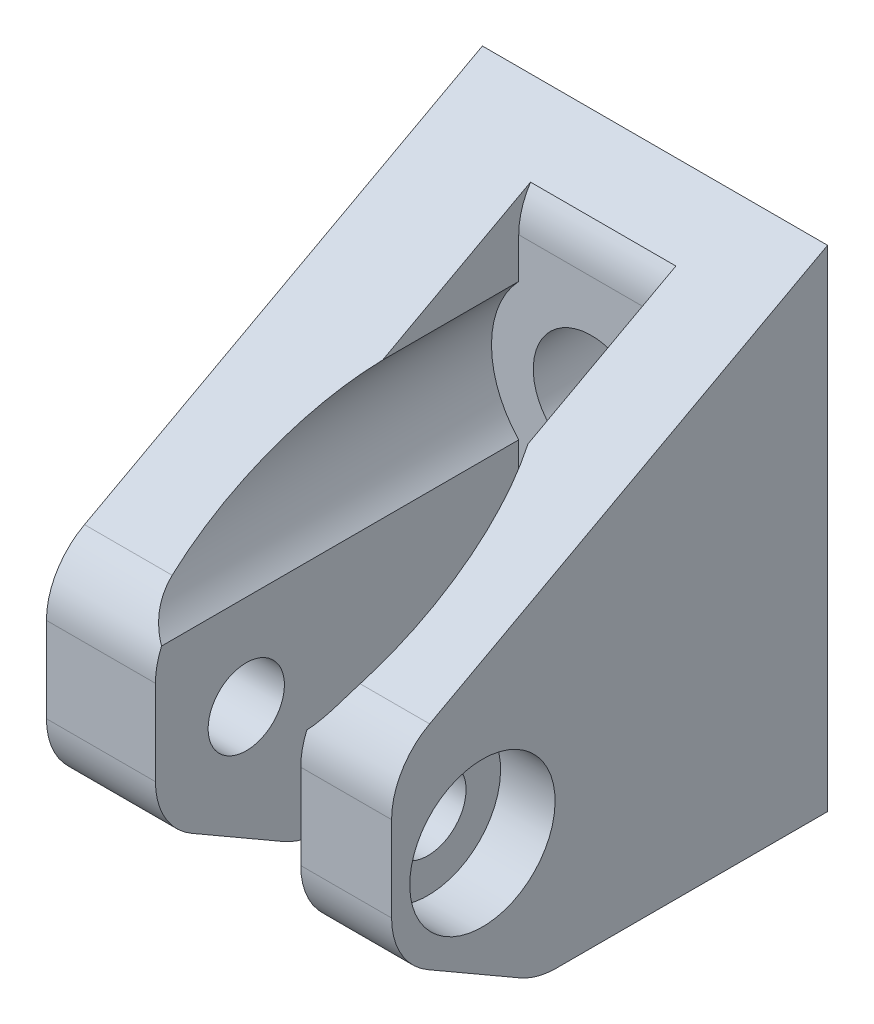
ISO-10303-21;
HEADER;
FILE_DESCRIPTION(('STEP AP214'),'2;1');
FILE_NAME('part.step','',(''),(''),'','','');
FILE_SCHEMA(('AUTOMOTIVE_DESIGN { 1 0 10303 214 1 1 1 1 }'));
ENDSEC;
DATA;
#1=APPLICATION_CONTEXT('core data for automotive mechanical design processes');
#2=APPLICATION_PROTOCOL_DEFINITION('international standard','automotive_design',2000,#1);
#3=PRODUCT_CONTEXT('',#1,'mechanical');
#4=PRODUCT('Part','Part','',(#3));
#5=PRODUCT_RELATED_PRODUCT_CATEGORY('part','',(#4));
#6=PRODUCT_DEFINITION_FORMATION('','',#4);
#7=PRODUCT_DEFINITION_CONTEXT('part definition',#1,'design');
#8=PRODUCT_DEFINITION('design','',#6,#7);
#9=PRODUCT_DEFINITION_SHAPE('','',#8);
#10=(LENGTH_UNIT() NAMED_UNIT(*) SI_UNIT(.MILLI.,.METRE.));
#11=(NAMED_UNIT(*) PLANE_ANGLE_UNIT() SI_UNIT($,.RADIAN.));
#12=(NAMED_UNIT(*) SI_UNIT($,.STERADIAN.) SOLID_ANGLE_UNIT());
#13=UNCERTAINTY_MEASURE_WITH_UNIT(LENGTH_MEASURE(1.E-05),#10,'distance_accuracy_value','');
#14=(GEOMETRIC_REPRESENTATION_CONTEXT(3) GLOBAL_UNCERTAINTY_ASSIGNED_CONTEXT((#13)) GLOBAL_UNIT_ASSIGNED_CONTEXT((#10,
#11,#12)) REPRESENTATION_CONTEXT('',''));
#15=CARTESIAN_POINT('',(0.,0.,0.));
#16=DIRECTION('',(0.,0.,1.));
#17=DIRECTION('',(1.,0.,0.));
#18=AXIS2_PLACEMENT_3D('',#15,#16,#17);
#19=CARTESIAN_POINT('',(-10.,-9.,19.));
#20=DIRECTION('',(1.,0.,0.));
#21=DIRECTION('',(0.,1.,0.));
#22=AXIS2_PLACEMENT_3D('',#19,#20,#21);
#23=CYLINDRICAL_SURFACE('',#22,2.1);
#24=CARTESIAN_POINT('',(4.,-9.,19.));
#25=DIRECTION('',(1.,0.,0.));
#26=DIRECTION('',(0.,1.,0.));
#27=AXIS2_PLACEMENT_3D('',#24,#25,#26);
#28=CIRCLE('',#27,2.1);
#29=CARTESIAN_POINT('',(4.,-6.9,19.));
#30=VERTEX_POINT('',#29);
#31=EDGE_CURVE('E318',#30,#30,#28,.T.);
#32=ORIENTED_EDGE('',*,*,#31,.F.);
#33=EDGE_LOOP('',(#32));
#34=FACE_BOUND('',#33,.T.);
#35=CARTESIAN_POINT('',(6.,-9.,19.));
#36=DIRECTION('',(1.,0.,0.));
#37=DIRECTION('',(0.,1.,0.));
#38=AXIS2_PLACEMENT_3D('',#35,#36,#37);
#39=CIRCLE('',#38,2.1);
#40=CARTESIAN_POINT('',(6.,-6.9,19.));
#41=VERTEX_POINT('',#40);
#42=EDGE_CURVE('E37',#41,#41,#39,.F.);
#43=ORIENTED_EDGE('',*,*,#42,.F.);
#44=EDGE_LOOP('',(#43));
#45=FACE_BOUND('',#44,.T.);
#46=ADVANCED_FACE('F32',(#34,#45),#23,.F.);
#47=CARTESIAN_POINT('',(-4.,17.,0.));
#48=DIRECTION('',(-1.,0.,0.));
#49=DIRECTION('',(0.,0.,1.));
#50=AXIS2_PLACEMENT_3D('',#47,#48,#49);
#51=PLANE('',#50);
#52=CARTESIAN_POINT('',(-4.,6.,0.));
#53=DIRECTION('',(-1.,0.,0.));
#54=DIRECTION('',(0.,0.,1.));
#55=AXIS2_PLACEMENT_3D('',#52,#53,#54);
#56=CIRCLE('',#55,4.);
#57=CARTESIAN_POINT('',(-4.,6.,4.));
#58=VERTEX_POINT('',#57);
#59=CARTESIAN_POINT('',(-4.,8.18523489932886,3.3503355704698));
#60=VERTEX_POINT('',#59);
#61=EDGE_CURVE('E435',#58,#60,#56,.T.);
#62=ORIENTED_EDGE('',*,*,#61,.T.);
#63=DIRECTION('',(0.,-0.476283148540753,0.879291966536774));
#64=VECTOR('',#63,1.);
#65=CARTESIAN_POINT('',(-4.,11.5879194630872,-2.93154362416107));
#66=LINE('',#65,#64);
#67=CARTESIAN_POINT('',(-4.,3.77491721763537,11.4924605212885));
#68=VERTEX_POINT('',#67);
#69=EDGE_CURVE('E344',#60,#68,#66,.T.);
#70=ORIENTED_EDGE('',*,*,#69,.T.);
#71=DIRECTION('',(0.,0.,-1.));
#72=VECTOR('',#71,1.);
#73=CARTESIAN_POINT('',(-4.,3.77491721763537,24.));
#74=LINE('',#73,#72);
#75=CARTESIAN_POINT('',(-4.,3.77491721763537,4.));
#76=VERTEX_POINT('',#75);
#77=EDGE_CURVE('E366',#76,#68,#74,.F.);
#78=ORIENTED_EDGE('',*,*,#77,.F.);
#79=DIRECTION('',(0.,1.,0.));
#80=VECTOR('',#79,1.);
#81=CARTESIAN_POINT('',(-4.,17.,4.));
#82=LINE('',#81,#80);
#83=EDGE_CURVE('E384',#76,#58,#82,.T.);
#84=ORIENTED_EDGE('',*,*,#83,.T.);
#85=EDGE_LOOP('',(#62,#70,#78,#84));
#86=FACE_BOUND('',#85,.T.);
#87=ADVANCED_FACE('F285',(#86),#51,.F.);
#88=CARTESIAN_POINT('',(-4.,-9.,19.));
#89=DIRECTION('',(-1.,0.,0.));
#90=DIRECTION('',(0.,0.,1.));
#91=AXIS2_PLACEMENT_3D('',#88,#89,#90);
#92=CIRCLE('',#91,2.1);
#93=CARTESIAN_POINT('',(-4.,-9.,21.1));
#94=VERTEX_POINT('',#93);
#95=EDGE_CURVE('E378',#94,#94,#92,.T.);
#96=ORIENTED_EDGE('',*,*,#95,.T.);
#97=EDGE_LOOP('',(#96));
#98=FACE_BOUND('',#97,.T.);
#99=DIRECTION('',(0.,0.,-1.));
#100=VECTOR('',#99,1.);
#101=CARTESIAN_POINT('',(-4.,-3.77491721763537,24.));
#102=LINE('',#101,#100);
#103=CARTESIAN_POINT('',(-4.,-3.77491721763537,23.6627646273285));
#104=VERTEX_POINT('',#103);
#105=CARTESIAN_POINT('',(-4.,-3.77491721763537,4.));
#106=VERTEX_POINT('',#105);
#107=EDGE_CURVE('E364',#104,#106,#102,.T.);
#108=ORIENTED_EDGE('',*,*,#107,.F.);
#109=CARTESIAN_POINT('',(-4.,-5.38244802131873,20.));
#110=DIRECTION('',(-1.,0.,0.));
#111=DIRECTION('',(0.,0.,1.));
#112=AXIS2_PLACEMENT_3D('',#109,#110,#111);
#113=CIRCLE('',#112,4.);
#114=CARTESIAN_POINT('',(-4.,-5.38244802131873,24.));
#115=VERTEX_POINT('',#114);
#116=EDGE_CURVE('E526',#104,#115,#113,.F.);
#117=ORIENTED_EDGE('',*,*,#116,.T.);
#118=DIRECTION('',(0.,1.,0.));
#119=VECTOR('',#118,1.);
#120=CARTESIAN_POINT('',(-4.,17.,24.));
#121=LINE('',#120,#119);
#122=CARTESIAN_POINT('',(-4.,-10.0717967697245,24.));
#123=VERTEX_POINT('',#122);
#124=EDGE_CURVE('E390',#123,#115,#121,.T.);
#125=ORIENTED_EDGE('',*,*,#124,.F.);
#126=CARTESIAN_POINT('',(-4.,-10.0717967697245,20.));
#127=DIRECTION('',(-1.,0.,0.));
#128=DIRECTION('',(0.,0.,1.));
#129=AXIS2_PLACEMENT_3D('',#126,#127,#128);
#130=CIRCLE('',#129,4.);
#131=CARTESIAN_POINT('',(-4.,-13.5358983848622,22.));
#132=VERTEX_POINT('',#131);
#133=EDGE_CURVE('E453',#123,#132,#130,.F.);
#134=ORIENTED_EDGE('',*,*,#133,.T.);
#135=DIRECTION('',(0.,-0.499999999999998,-0.86602540378444));
#136=VECTOR('',#135,1.);
#137=CARTESIAN_POINT('',(-4.,-12.381197846483,24.));
#138=LINE('',#137,#136);
#139=CARTESIAN_POINT('',(-4.,-16.4641016151378,16.9282032302754));
#140=VERTEX_POINT('',#139);
#141=EDGE_CURVE('E438',#132,#140,#138,.T.);
#142=ORIENTED_EDGE('',*,*,#141,.T.);
#143=CARTESIAN_POINT('',(-4.,-13.,14.9282032302755));
#144=DIRECTION('',(-1.,0.,0.));
#145=DIRECTION('',(0.,0.,1.));
#146=AXIS2_PLACEMENT_3D('',#143,#144,#145);
#147=CIRCLE('',#146,4.);
#148=CARTESIAN_POINT('',(-4.,-17.,14.9282032302755));
#149=VERTEX_POINT('',#148);
#150=EDGE_CURVE('E455',#140,#149,#147,.F.);
#151=ORIENTED_EDGE('',*,*,#150,.T.);
#152=DIRECTION('',(0.,0.,1.));
#153=VECTOR('',#152,1.);
#154=CARTESIAN_POINT('',(-4.,-17.,0.));
#155=LINE('',#154,#153);
#156=CARTESIAN_POINT('',(-4.,-17.,0.));
#157=VERTEX_POINT('',#156);
#158=EDGE_CURVE('E404',#157,#149,#155,.T.);
#159=ORIENTED_EDGE('',*,*,#158,.F.);
#160=DIRECTION('',(0.,-1.,0.));
#161=VECTOR('',#160,1.);
#162=CARTESIAN_POINT('',(-4.,-17.,0.));
#163=LINE('',#162,#161);
#164=CARTESIAN_POINT('',(-4.,-10.,0.));
#165=VERTEX_POINT('',#164);
#166=EDGE_CURVE('E393',#165,#157,#163,.T.);
#167=ORIENTED_EDGE('',*,*,#166,.F.);
#168=CARTESIAN_POINT('',(-4.,-6.,0.));
#169=DIRECTION('',(-1.,0.,0.));
#170=DIRECTION('',(0.,0.,1.));
#171=AXIS2_PLACEMENT_3D('',#168,#169,#170);
#172=CIRCLE('',#171,4.);
#173=CARTESIAN_POINT('',(-4.,-6.,4.));
#174=VERTEX_POINT('',#173);
#175=EDGE_CURVE('E428',#165,#174,#172,.T.);
#176=ORIENTED_EDGE('',*,*,#175,.T.);
#177=EDGE_CURVE('E391',#174,#106,#82,.T.);
#178=ORIENTED_EDGE('',*,*,#177,.T.);
#179=EDGE_LOOP('',(#108,#117,#125,#134,#142,#151,#159,#167,#176,#178));
#180=FACE_BOUND('',#179,.T.);
#181=ADVANCED_FACE('F288',(#98,#180),#51,.F.);
#182=CARTESIAN_POINT('',(4.,17.,0.));
#183=DIRECTION('',(1.,0.,0.));
#184=DIRECTION('',(0.,1.,0.));
#185=AXIS2_PLACEMENT_3D('',#182,#183,#184);
#186=PLANE('',#185);
#187=ORIENTED_EDGE('',*,*,#31,.T.);
#188=EDGE_LOOP('',(#187));
#189=FACE_BOUND('',#188,.T.);
#190=DIRECTION('',(0.,-1.,0.));
#191=VECTOR('',#190,1.);
#192=CARTESIAN_POINT('',(4.,-17.,24.));
#193=LINE('',#192,#191);
#194=CARTESIAN_POINT('',(4.,-5.38244802131873,24.));
#195=VERTEX_POINT('',#194);
#196=CARTESIAN_POINT('',(4.,-10.0717967697245,24.));
#197=VERTEX_POINT('',#196);
#198=EDGE_CURVE('E382',#195,#197,#193,.T.);
#199=ORIENTED_EDGE('',*,*,#198,.F.);
#200=CARTESIAN_POINT('',(4.,-5.38244802131873,20.));
#201=DIRECTION('',(1.,0.,0.));
#202=DIRECTION('',(0.,1.,0.));
#203=AXIS2_PLACEMENT_3D('',#200,#201,#202);
#204=CIRCLE('',#203,4.);
#205=CARTESIAN_POINT('',(4.,-3.77491721763537,23.6627646273285));
#206=VERTEX_POINT('',#205);
#207=EDGE_CURVE('E207',#195,#206,#204,.F.);
#208=ORIENTED_EDGE('',*,*,#207,.T.);
#209=DIRECTION('',(0.,0.,-1.));
#210=VECTOR('',#209,1.);
#211=CARTESIAN_POINT('',(4.,-3.77491721763537,24.));
#212=LINE('',#211,#210);
#213=CARTESIAN_POINT('',(4.,-3.77491721763537,4.));
#214=VERTEX_POINT('',#213);
#215=EDGE_CURVE('E361',#214,#206,#212,.F.);
#216=ORIENTED_EDGE('',*,*,#215,.F.);
#217=DIRECTION('',(0.,-1.,0.));
#218=VECTOR('',#217,1.);
#219=CARTESIAN_POINT('',(4.,-17.,4.));
#220=LINE('',#219,#218);
#221=CARTESIAN_POINT('',(4.,-6.,4.));
#222=VERTEX_POINT('',#221);
#223=EDGE_CURVE('E381',#214,#222,#220,.T.);
#224=ORIENTED_EDGE('',*,*,#223,.T.);
#225=CARTESIAN_POINT('',(4.,-6.,0.));
#226=DIRECTION('',(1.,0.,0.));
#227=DIRECTION('',(0.,0.,-1.));
#228=AXIS2_PLACEMENT_3D('',#225,#226,#227);
#229=CIRCLE('',#228,4.);
#230=CARTESIAN_POINT('',(4.,-10.,0.));
#231=VERTEX_POINT('',#230);
#232=EDGE_CURVE('E431',#222,#231,#229,.T.);
#233=ORIENTED_EDGE('',*,*,#232,.T.);
#234=DIRECTION('',(0.,1.,0.));
#235=VECTOR('',#234,1.);
#236=CARTESIAN_POINT('',(4.,-17.,0.));
#237=LINE('',#236,#235);
#238=CARTESIAN_POINT('',(4.,-17.,0.));
#239=VERTEX_POINT('',#238);
#240=EDGE_CURVE('E398',#239,#231,#237,.T.);
#241=ORIENTED_EDGE('',*,*,#240,.F.);
#242=DIRECTION('',(0.,0.,1.));
#243=VECTOR('',#242,1.);
#244=CARTESIAN_POINT('',(4.,-17.,0.));
#245=LINE('',#244,#243);
#246=CARTESIAN_POINT('',(4.,-17.,14.9282032302755));
#247=VERTEX_POINT('',#246);
#248=EDGE_CURVE('E405',#239,#247,#245,.T.);
#249=ORIENTED_EDGE('',*,*,#248,.T.);
#250=CARTESIAN_POINT('',(4.,-13.,14.9282032302755));
#251=DIRECTION('',(1.,0.,0.));
#252=DIRECTION('',(0.,1.,0.));
#253=AXIS2_PLACEMENT_3D('',#250,#251,#252);
#254=CIRCLE('',#253,4.);
#255=CARTESIAN_POINT('',(4.,-16.4641016151378,16.9282032302754));
#256=VERTEX_POINT('',#255);
#257=EDGE_CURVE('E448',#247,#256,#254,.F.);
#258=ORIENTED_EDGE('',*,*,#257,.T.);
#259=DIRECTION('',(0.,-0.499999999999998,-0.86602540378444));
#260=VECTOR('',#259,1.);
#261=CARTESIAN_POINT('',(4.,-12.381197846483,24.));
#262=LINE('',#261,#260);
#263=CARTESIAN_POINT('',(4.,-13.5358983848622,22.));
#264=VERTEX_POINT('',#263);
#265=EDGE_CURVE('E445',#256,#264,#262,.F.);
#266=ORIENTED_EDGE('',*,*,#265,.T.);
#267=CARTESIAN_POINT('',(4.,-10.0717967697245,20.));
#268=DIRECTION('',(1.,0.,0.));
#269=DIRECTION('',(0.,1.,0.));
#270=AXIS2_PLACEMENT_3D('',#267,#268,#269);
#271=CIRCLE('',#270,4.);
#272=EDGE_CURVE('E450',#264,#197,#271,.F.);
#273=ORIENTED_EDGE('',*,*,#272,.T.);
#274=EDGE_LOOP('',(#199,#208,#216,#224,#233,#241,#249,#258,#266,#273));
#275=FACE_BOUND('',#274,.T.);
#276=ADVANCED_FACE('F290',(#189,#275),#186,.F.);
#277=DIRECTION('',(0.,0.,-1.));
#278=VECTOR('',#277,1.);
#279=CARTESIAN_POINT('',(4.,3.77491721763537,24.));
#280=LINE('',#279,#278);
#281=CARTESIAN_POINT('',(4.,3.77491721763537,11.4924605212885));
#282=VERTEX_POINT('',#281);
#283=CARTESIAN_POINT('',(4.,3.77491721763537,4.));
#284=VERTEX_POINT('',#283);
#285=EDGE_CURVE('E359',#282,#284,#280,.T.);
#286=ORIENTED_EDGE('',*,*,#285,.F.);
#287=DIRECTION('',(0.,0.476283148540753,-0.879291966536774));
#288=VECTOR('',#287,1.);
#289=CARTESIAN_POINT('',(4.,11.5879194630872,-2.93154362416107));
#290=LINE('',#289,#288);
#291=CARTESIAN_POINT('',(4.,8.18523489932886,3.3503355704698));
#292=VERTEX_POINT('',#291);
#293=EDGE_CURVE('E349',#282,#292,#290,.T.);
#294=ORIENTED_EDGE('',*,*,#293,.T.);
#295=CARTESIAN_POINT('',(4.,6.,0.));
#296=DIRECTION('',(1.,0.,0.));
#297=DIRECTION('',(0.,1.,0.));
#298=AXIS2_PLACEMENT_3D('',#295,#296,#297);
#299=CIRCLE('',#298,4.);
#300=CARTESIAN_POINT('',(4.,6.,4.));
#301=VERTEX_POINT('',#300);
#302=EDGE_CURVE('E433',#292,#301,#299,.T.);
#303=ORIENTED_EDGE('',*,*,#302,.T.);
#304=EDGE_CURVE('E385',#301,#284,#220,.T.);
#305=ORIENTED_EDGE('',*,*,#304,.T.);
#306=EDGE_LOOP('',(#286,#294,#303,#305));
#307=FACE_BOUND('',#306,.T.);
#308=ADVANCED_FACE('F293',(#307),#186,.F.);
#309=CARTESIAN_POINT('',(0.,0.,24.));
#310=DIRECTION('',(0.,0.,1.));
#311=DIRECTION('',(1.,0.,0.));
#312=AXIS2_PLACEMENT_3D('',#309,#310,#311);
#313=PLANE('',#312);
#314=ORIENTED_EDGE('',*,*,#124,.T.);
#315=DIRECTION('',(1.,0.,0.));
#316=VECTOR('',#315,1.);
#317=CARTESIAN_POINT('',(-10.,-5.38244802131873,24.));
#318=LINE('',#317,#316);
#319=CARTESIAN_POINT('',(-10.,-5.38244802131873,24.));
#320=VERTEX_POINT('',#319);
#321=EDGE_CURVE('E56',#115,#320,#318,.F.);
#322=ORIENTED_EDGE('',*,*,#321,.T.);
#323=DIRECTION('',(0.,-1.,0.));
#324=VECTOR('',#323,1.);
#325=CARTESIAN_POINT('',(-10.,17.,24.));
#326=LINE('',#325,#324);
#327=CARTESIAN_POINT('',(-10.,-10.0717967697245,24.));
#328=VERTEX_POINT('',#327);
#329=EDGE_CURVE('E388',#320,#328,#326,.T.);
#330=ORIENTED_EDGE('',*,*,#329,.T.);
#331=DIRECTION('',(1.,0.,0.));
#332=VECTOR('',#331,1.);
#333=CARTESIAN_POINT('',(0.,-10.0717967697245,24.));
#334=LINE('',#333,#332);
#335=EDGE_CURVE('E462',#328,#123,#334,.T.);
#336=ORIENTED_EDGE('',*,*,#335,.T.);
#337=EDGE_LOOP('',(#314,#322,#330,#336));
#338=FACE_BOUND('',#337,.T.);
#339=ADVANCED_FACE('F295',(#338),#313,.T.);
#340=CARTESIAN_POINT('',(0.,0.,24.));
#341=DIRECTION('',(0.,0.,-1.));
#342=DIRECTION('',(-1.,0.,0.));
#343=AXIS2_PLACEMENT_3D('',#340,#341,#342);
#344=PLANE('',#343);
#345=DIRECTION('',(-1.,0.,0.));
#346=VECTOR('',#345,1.);
#347=CARTESIAN_POINT('',(10.,-10.0717967697245,24.));
#348=LINE('',#347,#346);
#349=CARTESIAN_POINT('',(9.,-10.0717967697245,24.));
#350=VERTEX_POINT('',#349);
#351=EDGE_CURVE('E200',#197,#350,#348,.F.);
#352=ORIENTED_EDGE('',*,*,#351,.T.);
#353=DIRECTION('',(0.,1.,0.));
#354=VECTOR('',#353,1.);
#355=CARTESIAN_POINT('',(9.,0.,24.));
#356=LINE('',#355,#354);
#357=CARTESIAN_POINT('',(9.,-5.38244802131873,24.));
#358=VERTEX_POINT('',#357);
#359=EDGE_CURVE('E188',#350,#358,#356,.T.);
#360=ORIENTED_EDGE('',*,*,#359,.T.);
#361=DIRECTION('',(1.,0.,0.));
#362=VECTOR('',#361,1.);
#363=CARTESIAN_POINT('',(0.,-5.38244802131873,24.));
#364=LINE('',#363,#362);
#365=EDGE_CURVE('E197',#358,#195,#364,.F.);
#366=ORIENTED_EDGE('',*,*,#365,.T.);
#367=ORIENTED_EDGE('',*,*,#198,.T.);
#368=EDGE_LOOP('',(#352,#360,#366,#367));
#369=FACE_BOUND('',#368,.T.);
#370=ADVANCED_FACE('F196',(#369),#344,.F.);
#371=CARTESIAN_POINT('',(0.,0.,4.));
#372=DIRECTION('',(0.,0.,1.));
#373=DIRECTION('',(1.,0.,0.));
#374=AXIS2_PLACEMENT_3D('',#371,#372,#373);
#375=PLANE('',#374);
#376=CARTESIAN_POINT('',(0.,0.,4.));
#377=DIRECTION('',(0.,0.,1.));
#378=DIRECTION('',(1.,0.,0.));
#379=AXIS2_PLACEMENT_3D('',#376,#377,#378);
#380=CIRCLE('',#379,5.5);
#381=EDGE_CURVE('E358',#76,#106,#380,.T.);
#382=ORIENTED_EDGE('',*,*,#381,.T.);
#383=ORIENTED_EDGE('',*,*,#177,.F.);
#384=DIRECTION('',(-1.,0.,0.));
#385=VECTOR('',#384,1.);
#386=CARTESIAN_POINT('',(4.,-6.,4.));
#387=LINE('',#386,#385);
#388=EDGE_CURVE('E425',#174,#222,#387,.F.);
#389=ORIENTED_EDGE('',*,*,#388,.T.);
#390=ORIENTED_EDGE('',*,*,#223,.F.);
#391=EDGE_CURVE('E355',#214,#284,#380,.T.);
#392=ORIENTED_EDGE('',*,*,#391,.T.);
#393=ORIENTED_EDGE('',*,*,#304,.F.);
#394=DIRECTION('',(1.,0.,0.));
#395=VECTOR('',#394,1.);
#396=CARTESIAN_POINT('',(-4.,6.,4.));
#397=LINE('',#396,#395);
#398=EDGE_CURVE('E422',#301,#58,#397,.F.);
#399=ORIENTED_EDGE('',*,*,#398,.T.);
#400=ORIENTED_EDGE('',*,*,#83,.F.);
#401=EDGE_LOOP('',(#382,#383,#389,#390,#392,#393,#399,#400));
#402=FACE_BOUND('',#401,.T.);
#403=CARTESIAN_POINT('',(0.,0.,4.));
#404=DIRECTION('',(0.,0.,1.));
#405=DIRECTION('',(1.,0.,0.));
#406=AXIS2_PLACEMENT_3D('',#403,#404,#405);
#407=CIRCLE('',#406,3.2);
#408=CARTESIAN_POINT('',(3.2,0.,4.));
#409=VERTEX_POINT('',#408);
#410=EDGE_CURVE('E369',#409,#409,#407,.T.);
#411=ORIENTED_EDGE('',*,*,#410,.F.);
#412=EDGE_LOOP('',(#411));
#413=FACE_BOUND('',#412,.T.);
#414=ADVANCED_FACE('F281',(#402,#413),#375,.T.);
#415=CARTESIAN_POINT('',(-10.,-17.,4.));
#416=DIRECTION('',(0.,1.,0.));
#417=DIRECTION('',(0.,0.,1.));
#418=AXIS2_PLACEMENT_3D('',#415,#416,#417);
#419=PLANE('',#418);
#420=ORIENTED_EDGE('',*,*,#158,.T.);
#421=DIRECTION('',(-1.,0.,0.));
#422=VECTOR('',#421,1.);
#423=CARTESIAN_POINT('',(-10.,-17.,14.9282032302755));
#424=LINE('',#423,#422);
#425=CARTESIAN_POINT('',(-10.,-17.,14.9282032302755));
#426=VERTEX_POINT('',#425);
#427=EDGE_CURVE('E473',#149,#426,#424,.T.);
#428=ORIENTED_EDGE('',*,*,#427,.T.);
#429=DIRECTION('',(0.,0.,-1.));
#430=VECTOR('',#429,1.);
#431=CARTESIAN_POINT('',(-10.,-17.,4.));
#432=LINE('',#431,#430);
#433=CARTESIAN_POINT('',(-10.,-17.,0.));
#434=VERTEX_POINT('',#433);
#435=EDGE_CURVE('E419',#426,#434,#432,.T.);
#436=ORIENTED_EDGE('',*,*,#435,.T.);
#437=DIRECTION('',(1.,0.,0.));
#438=VECTOR('',#437,1.);
#439=CARTESIAN_POINT('',(-10.,-17.,0.));
#440=LINE('',#439,#438);
#441=EDGE_CURVE('E416',#434,#157,#440,.T.);
#442=ORIENTED_EDGE('',*,*,#441,.T.);
#443=EDGE_LOOP('',(#420,#428,#436,#442));
#444=FACE_BOUND('',#443,.T.);
#445=ADVANCED_FACE('F273',(#444),#419,.F.);
#446=CARTESIAN_POINT('',(-10.,17.,4.));
#447=DIRECTION('',(1.,0.,0.));
#448=DIRECTION('',(0.,1.,0.));
#449=AXIS2_PLACEMENT_3D('',#446,#447,#448);
#450=PLANE('',#449);
#451=CARTESIAN_POINT('',(-10.,-9.,19.));
#452=DIRECTION('',(1.,0.,0.));
#453=DIRECTION('',(0.,1.,0.));
#454=AXIS2_PLACEMENT_3D('',#451,#452,#453);
#455=CIRCLE('',#454,2.1);
#456=CARTESIAN_POINT('',(-10.,-6.9,19.));
#457=VERTEX_POINT('',#456);
#458=EDGE_CURVE('E373',#457,#457,#455,.T.);
#459=ORIENTED_EDGE('',*,*,#458,.T.);
#460=EDGE_LOOP('',(#459));
#461=FACE_BOUND('',#460,.T.);
#462=ORIENTED_EDGE('',*,*,#329,.F.);
#463=CARTESIAN_POINT('',(-10.,-5.38244802131873,20.));
#464=DIRECTION('',(1.,0.,0.));
#465=DIRECTION('',(0.,1.,0.));
#466=AXIS2_PLACEMENT_3D('',#463,#464,#465);
#467=CIRCLE('',#466,4.);
#468=CARTESIAN_POINT('',(-10.,-1.86528015517163,21.905132594163));
#469=VERTEX_POINT('',#468);
#470=EDGE_CURVE('E42',#320,#469,#467,.F.);
#471=ORIENTED_EDGE('',*,*,#470,.T.);
#472=DIRECTION('',(0.,0.476283148540753,-0.879291966536774));
#473=VECTOR('',#472,1.);
#474=CARTESIAN_POINT('',(-10.,10.,0.));
#475=LINE('',#474,#473);
#476=CARTESIAN_POINT('',(-10.,10.,0.));
#477=VERTEX_POINT('',#476);
#478=EDGE_CURVE('E342',#469,#477,#475,.T.);
#479=ORIENTED_EDGE('',*,*,#478,.T.);
#480=DIRECTION('',(0.,-1.,0.));
#481=VECTOR('',#480,1.);
#482=CARTESIAN_POINT('',(-10.,17.,0.));
#483=LINE('',#482,#481);
#484=EDGE_CURVE('E413',#477,#434,#483,.T.);
#485=ORIENTED_EDGE('',*,*,#484,.T.);
#486=ORIENTED_EDGE('',*,*,#435,.F.);
#487=CARTESIAN_POINT('',(-10.,-13.,14.9282032302755));
#488=DIRECTION('',(1.,0.,0.));
#489=DIRECTION('',(0.,1.,0.));
#490=AXIS2_PLACEMENT_3D('',#487,#488,#489);
#491=CIRCLE('',#490,4.);
#492=CARTESIAN_POINT('',(-10.,-16.4641016151378,16.9282032302754));
#493=VERTEX_POINT('',#492);
#494=EDGE_CURVE('E460',#426,#493,#491,.F.);
#495=ORIENTED_EDGE('',*,*,#494,.T.);
#496=DIRECTION('',(0.,0.499999999999998,0.86602540378444));
#497=VECTOR('',#496,1.);
#498=CARTESIAN_POINT('',(-10.,-12.381197846483,24.));
#499=LINE('',#498,#497);
#500=CARTESIAN_POINT('',(-10.,-13.5358983848622,22.));
#501=VERTEX_POINT('',#500);
#502=EDGE_CURVE('E442',#493,#501,#499,.T.);
#503=ORIENTED_EDGE('',*,*,#502,.T.);
#504=CARTESIAN_POINT('',(-10.,-10.0717967697245,20.));
#505=DIRECTION('',(1.,0.,0.));
#506=DIRECTION('',(0.,1.,0.));
#507=AXIS2_PLACEMENT_3D('',#504,#505,#506);
#508=CIRCLE('',#507,4.);
#509=EDGE_CURVE('E457',#501,#328,#508,.F.);
#510=ORIENTED_EDGE('',*,*,#509,.T.);
#511=EDGE_LOOP('',(#462,#471,#479,#485,#486,#495,#503,#510));
#512=FACE_BOUND('',#511,.T.);
#513=ADVANCED_FACE('F269',(#461,#512),#450,.F.);
#514=CARTESIAN_POINT('',(9.,-17.,0.));
#515=VERTEX_POINT('',#514);
#516=EDGE_CURVE('E415',#239,#515,#440,.T.);
#517=ORIENTED_EDGE('',*,*,#516,.T.);
#518=DIRECTION('',(0.,0.,1.));
#519=VECTOR('',#518,1.);
#520=CARTESIAN_POINT('',(9.,-17.,4.));
#521=LINE('',#520,#519);
#522=CARTESIAN_POINT('',(9.,-17.,14.9282032302755));
#523=VERTEX_POINT('',#522);
#524=EDGE_CURVE('E202',#515,#523,#521,.T.);
#525=ORIENTED_EDGE('',*,*,#524,.T.);
#526=DIRECTION('',(1.,0.,0.));
#527=VECTOR('',#526,1.);
#528=CARTESIAN_POINT('',(4.,-17.,14.9282032302755));
#529=LINE('',#528,#527);
#530=EDGE_CURVE('E471',#523,#247,#529,.F.);
#531=ORIENTED_EDGE('',*,*,#530,.T.);
#532=ORIENTED_EDGE('',*,*,#248,.F.);
#533=EDGE_LOOP('',(#517,#525,#531,#532));
#534=FACE_BOUND('',#533,.T.);
#535=ADVANCED_FACE('F272',(#534),#419,.F.);
#536=CARTESIAN_POINT('',(0.,0.,0.));
#537=DIRECTION('',(0.,0.,1.));
#538=DIRECTION('',(1.,0.,0.));
#539=AXIS2_PLACEMENT_3D('',#536,#537,#538);
#540=PLANE('',#539);
#541=CARTESIAN_POINT('',(0.,0.,0.));
#542=DIRECTION('',(0.,0.,1.));
#543=DIRECTION('',(1.,0.,0.));
#544=AXIS2_PLACEMENT_3D('',#541,#542,#543);
#545=CIRCLE('',#544,3.2);
#546=CARTESIAN_POINT('',(3.2,0.,0.));
#547=VERTEX_POINT('',#546);
#548=EDGE_CURVE('E370',#547,#547,#545,.T.);
#549=ORIENTED_EDGE('',*,*,#548,.T.);
#550=EDGE_LOOP('',(#549));
#551=FACE_BOUND('',#550,.T.);
#552=DIRECTION('',(1.,0.,0.));
#553=VECTOR('',#552,1.);
#554=CARTESIAN_POINT('',(-4.,10.,0.));
#555=LINE('',#554,#553);
#556=CARTESIAN_POINT('',(9.,10.,0.));
#557=VERTEX_POINT('',#556);
#558=EDGE_CURVE('E408',#477,#557,#555,.T.);
#559=ORIENTED_EDGE('',*,*,#558,.T.);
#560=DIRECTION('',(0.,-1.,0.));
#561=VECTOR('',#560,1.);
#562=CARTESIAN_POINT('',(9.,0.,0.));
#563=LINE('',#562,#561);
#564=EDGE_CURVE('E323',#557,#515,#563,.T.);
#565=ORIENTED_EDGE('',*,*,#564,.T.);
#566=ORIENTED_EDGE('',*,*,#516,.F.);
#567=ORIENTED_EDGE('',*,*,#240,.T.);
#568=DIRECTION('',(-1.,0.,0.));
#569=VECTOR('',#568,1.);
#570=CARTESIAN_POINT('',(-4.,-10.,0.));
#571=LINE('',#570,#569);
#572=EDGE_CURVE('E401',#231,#165,#571,.T.);
#573=ORIENTED_EDGE('',*,*,#572,.T.);
#574=ORIENTED_EDGE('',*,*,#166,.T.);
#575=ORIENTED_EDGE('',*,*,#441,.F.);
#576=ORIENTED_EDGE('',*,*,#484,.F.);
#577=EDGE_LOOP('',(#559,#565,#566,#567,#573,#574,#575,#576));
#578=FACE_BOUND('',#577,.T.);
#579=ADVANCED_FACE('F267',(#551,#578),#540,.F.);
#580=CARTESIAN_POINT('',(-4.,-6.,0.));
#581=DIRECTION('',(1.,0.,0.));
#582=DIRECTION('',(0.,0.,-1.));
#583=AXIS2_PLACEMENT_3D('',#580,#581,#582);
#584=CYLINDRICAL_SURFACE('',#583,4.);
#585=ORIENTED_EDGE('',*,*,#232,.F.);
#586=ORIENTED_EDGE('',*,*,#388,.F.);
#587=ORIENTED_EDGE('',*,*,#175,.F.);
#588=ORIENTED_EDGE('',*,*,#572,.F.);
#589=EDGE_LOOP('',(#585,#586,#587,#588));
#590=FACE_BOUND('',#589,.T.);
#591=ADVANCED_FACE('F263',(#590),#584,.T.);
#592=CARTESIAN_POINT('',(-4.,6.,0.));
#593=DIRECTION('',(-1.,0.,0.));
#594=DIRECTION('',(0.,0.,1.));
#595=AXIS2_PLACEMENT_3D('',#592,#593,#594);
#596=CYLINDRICAL_SURFACE('',#595,4.);
#597=DIRECTION('',(-1.,0.,0.));
#598=VECTOR('',#597,1.);
#599=CARTESIAN_POINT('',(-4.,8.18523489932886,3.3503355704698));
#600=LINE('',#599,#598);
#601=EDGE_CURVE('E347',#60,#292,#600,.F.);
#602=ORIENTED_EDGE('',*,*,#601,.F.);
#603=ORIENTED_EDGE('',*,*,#61,.F.);
#604=ORIENTED_EDGE('',*,*,#398,.F.);
#605=ORIENTED_EDGE('',*,*,#302,.F.);
#606=EDGE_LOOP('',(#602,#603,#604,#605));
#607=FACE_BOUND('',#606,.T.);
#608=ADVANCED_FACE('F260',(#607),#596,.T.);
#609=ORIENTED_EDGE('',*,*,#458,.F.);
#610=EDGE_LOOP('',(#609));
#611=FACE_BOUND('',#610,.T.);
#612=ORIENTED_EDGE('',*,*,#95,.F.);
#613=EDGE_LOOP('',(#612));
#614=FACE_BOUND('',#613,.T.);
#615=ADVANCED_FACE('F258',(#611,#614),#23,.F.);
#616=CARTESIAN_POINT('',(0.,-12.381197846483,24.));
#617=DIRECTION('',(0.,-0.86602540378444,0.499999999999998));
#618=DIRECTION('',(-1.,0.,0.));
#619=AXIS2_PLACEMENT_3D('',#616,#617,#618);
#620=PLANE('',#619);
#621=ORIENTED_EDGE('',*,*,#502,.F.);
#622=DIRECTION('',(-1.,0.,0.));
#623=VECTOR('',#622,1.);
#624=CARTESIAN_POINT('',(-4.,-16.4641016151378,16.9282032302755));
#625=LINE('',#624,#623);
#626=EDGE_CURVE('E478',#493,#140,#625,.F.);
#627=ORIENTED_EDGE('',*,*,#626,.T.);
#628=ORIENTED_EDGE('',*,*,#141,.F.);
#629=DIRECTION('',(1.,0.,0.));
#630=VECTOR('',#629,1.);
#631=CARTESIAN_POINT('',(0.,-13.5358983848622,22.));
#632=LINE('',#631,#630);
#633=EDGE_CURVE('E476',#132,#501,#632,.F.);
#634=ORIENTED_EDGE('',*,*,#633,.T.);
#635=EDGE_LOOP('',(#621,#627,#628,#634));
#636=FACE_BOUND('',#635,.T.);
#637=ADVANCED_FACE('F254',(#636),#620,.T.);
#638=CARTESIAN_POINT('',(0.,-12.381197846483,24.));
#639=DIRECTION('',(0.,0.86602540378444,-0.499999999999998));
#640=DIRECTION('',(1.,0.,0.));
#641=AXIS2_PLACEMENT_3D('',#638,#639,#640);
#642=PLANE('',#641);
#643=DIRECTION('',(0.,0.499999999999998,0.86602540378444));
#644=VECTOR('',#643,1.);
#645=CARTESIAN_POINT('',(9.,-12.381197846483,24.));
#646=LINE('',#645,#644);
#647=CARTESIAN_POINT('',(9.,-13.5358983848622,22.));
#648=VERTEX_POINT('',#647);
#649=CARTESIAN_POINT('',(9.,-16.4641016151378,16.9282032302754));
#650=VERTEX_POINT('',#649);
#651=EDGE_CURVE('E340',#648,#650,#646,.F.);
#652=ORIENTED_EDGE('',*,*,#651,.F.);
#653=DIRECTION('',(1.,0.,0.));
#654=VECTOR('',#653,1.);
#655=CARTESIAN_POINT('',(4.,-13.5358983848622,22.));
#656=LINE('',#655,#654);
#657=EDGE_CURVE('E469',#648,#264,#656,.F.);
#658=ORIENTED_EDGE('',*,*,#657,.T.);
#659=ORIENTED_EDGE('',*,*,#265,.F.);
#660=DIRECTION('',(-1.,0.,0.));
#661=VECTOR('',#660,1.);
#662=CARTESIAN_POINT('',(10.,-16.4641016151378,16.9282032302755));
#663=LINE('',#662,#661);
#664=EDGE_CURVE('E466',#256,#650,#663,.F.);
#665=ORIENTED_EDGE('',*,*,#664,.T.);
#666=EDGE_LOOP('',(#652,#658,#659,#665));
#667=FACE_BOUND('',#666,.T.);
#668=ADVANCED_FACE('F250',(#667),#642,.F.);
#669=CARTESIAN_POINT('',(0.,-10.0717967697245,20.));
#670=DIRECTION('',(1.,0.,0.));
#671=DIRECTION('',(0.,0.,-1.));
#672=AXIS2_PLACEMENT_3D('',#669,#670,#671);
#673=CYLINDRICAL_SURFACE('',#672,4.);
#674=CARTESIAN_POINT('',(9.,-10.0717967697245,20.));
#675=DIRECTION('',(-1.,0.,0.));
#676=DIRECTION('',(0.,-1.,0.));
#677=AXIS2_PLACEMENT_3D('',#674,#675,#676);
#678=CIRCLE('',#677,4.);
#679=EDGE_CURVE('E338',#350,#648,#678,.F.);
#680=ORIENTED_EDGE('',*,*,#679,.F.);
#681=ORIENTED_EDGE('',*,*,#351,.F.);
#682=ORIENTED_EDGE('',*,*,#272,.F.);
#683=ORIENTED_EDGE('',*,*,#657,.F.);
#684=EDGE_LOOP('',(#680,#681,#682,#683));
#685=FACE_BOUND('',#684,.T.);
#686=ADVANCED_FACE('F246',(#685),#673,.T.);
#687=CARTESIAN_POINT('',(-10.,-13.,14.9282032302755));
#688=DIRECTION('',(-1.,0.,0.));
#689=DIRECTION('',(0.,0.,1.));
#690=AXIS2_PLACEMENT_3D('',#687,#688,#689);
#691=CYLINDRICAL_SURFACE('',#690,4.);
#692=CARTESIAN_POINT('',(9.,-13.,14.9282032302755));
#693=DIRECTION('',(-1.,0.,0.));
#694=DIRECTION('',(0.,-1.,0.));
#695=AXIS2_PLACEMENT_3D('',#692,#693,#694);
#696=CIRCLE('',#695,4.);
#697=EDGE_CURVE('E201',#650,#523,#696,.F.);
#698=ORIENTED_EDGE('',*,*,#697,.F.);
#699=ORIENTED_EDGE('',*,*,#664,.F.);
#700=ORIENTED_EDGE('',*,*,#257,.F.);
#701=ORIENTED_EDGE('',*,*,#530,.F.);
#702=EDGE_LOOP('',(#698,#699,#700,#701));
#703=FACE_BOUND('',#702,.T.);
#704=ADVANCED_FACE('F242',(#703),#691,.T.);
#705=CARTESIAN_POINT('',(-10.,-13.,14.9282032302755));
#706=DIRECTION('',(1.,0.,0.));
#707=DIRECTION('',(0.,0.,-1.));
#708=AXIS2_PLACEMENT_3D('',#705,#706,#707);
#709=CYLINDRICAL_SURFACE('',#708,4.);
#710=ORIENTED_EDGE('',*,*,#150,.F.);
#711=ORIENTED_EDGE('',*,*,#626,.F.);
#712=ORIENTED_EDGE('',*,*,#494,.F.);
#713=ORIENTED_EDGE('',*,*,#427,.F.);
#714=EDGE_LOOP('',(#710,#711,#712,#713));
#715=FACE_BOUND('',#714,.T.);
#716=ADVANCED_FACE('F238',(#715),#709,.T.);
#717=CARTESIAN_POINT('',(0.,-10.0717967697245,20.));
#718=DIRECTION('',(1.,0.,0.));
#719=DIRECTION('',(0.,0.,-1.));
#720=AXIS2_PLACEMENT_3D('',#717,#718,#719);
#721=CYLINDRICAL_SURFACE('',#720,4.);
#722=ORIENTED_EDGE('',*,*,#509,.F.);
#723=ORIENTED_EDGE('',*,*,#633,.F.);
#724=ORIENTED_EDGE('',*,*,#133,.F.);
#725=ORIENTED_EDGE('',*,*,#335,.F.);
#726=EDGE_LOOP('',(#722,#723,#724,#725));
#727=FACE_BOUND('',#726,.T.);
#728=ADVANCED_FACE('F234',(#727),#721,.T.);
#729=CARTESIAN_POINT('',(0.,0.,0.));
#730=DIRECTION('',(0.,0.,1.));
#731=DIRECTION('',(1.,0.,0.));
#732=AXIS2_PLACEMENT_3D('',#729,#730,#731);
#733=CYLINDRICAL_SURFACE('',#732,3.2);
#734=ORIENTED_EDGE('',*,*,#548,.F.);
#735=EDGE_LOOP('',(#734));
#736=FACE_BOUND('',#735,.T.);
#737=ORIENTED_EDGE('',*,*,#410,.T.);
#738=EDGE_LOOP('',(#737));
#739=FACE_BOUND('',#738,.T.);
#740=ADVANCED_FACE('F237',(#736,#739),#733,.F.);
#741=CARTESIAN_POINT('',(0.,0.,24.));
#742=DIRECTION('',(0.,0.,-1.));
#743=DIRECTION('',(-1.,0.,0.));
#744=AXIS2_PLACEMENT_3D('',#741,#742,#743);
#745=CYLINDRICAL_SURFACE('',#744,5.5);
#746=ORIENTED_EDGE('',*,*,#215,.T.);
#747=CARTESIAN_POINT('',(4.,-3.77491721763537,23.6627646273285));
#748=CARTESIAN_POINT('',(4.06644369424371,-3.70454585409571,23.6318938409342));
#749=CARTESIAN_POINT('',(4.1303691497625,-3.63305390845873,23.5980848076198));
#750=CARTESIAN_POINT('',(4.25296195575197,-3.48872673399084,23.5242540048707));
#751=CARTESIAN_POINT('',(4.31162709388245,-3.41589095536562,23.4842296405969));
#752=CARTESIAN_POINT('',(4.42338154612011,-3.2698867882511,23.397688253468));
#753=CARTESIAN_POINT('',(4.47647482487484,-3.19671867544371,23.3511759027764));
#754=CARTESIAN_POINT('',(4.5770026266457,-3.05104460769291,23.2515138250307));
#755=CARTESIAN_POINT('',(4.62443838988639,-2.97853851085445,23.1983655579319));
#756=CARTESIAN_POINT('',(4.71382454641792,-2.83496692440622,23.0852425739894));
#757=CARTESIAN_POINT('',(4.75575455083751,-2.76390756968017,23.0252439411243));
#758=CARTESIAN_POINT('',(4.83405966658356,-2.62454891430457,22.8987663283659));
#759=CARTESIAN_POINT('',(4.87043478831545,-2.55624960848508,22.832287360612));
#760=CARTESIAN_POINT('',(4.93782799282781,-2.42350753642274,22.6933047305855));
#761=CARTESIAN_POINT('',(4.96885498324561,-2.3590584767023,22.6208113899353));
#762=CARTESIAN_POINT('',(5.02596912743448,-2.23479513428228,22.4701841225997));
#763=CARTESIAN_POINT('',(5.0520583943539,-2.17497887543345,22.3920526286828));
#764=CARTESIAN_POINT('',(5.09499571631426,-2.07207213165866,22.2467060215608));
#765=CARTESIAN_POINT('',(5.11265004008564,-2.02801932978317,22.1804050070233));
#766=CARTESIAN_POINT('',(5.14528453594254,-1.94372817653322,22.0448917796737));
#767=CARTESIAN_POINT('',(5.16026758708478,-1.90348574061827,21.9756828016914));
#768=CARTESIAN_POINT('',(5.17404386749116,-1.86528015517163,21.905132594163));
#769=B_SPLINE_CURVE_WITH_KNOTS('',3,(#747,#748,#749,#750,#751,#752,#753,#754,#755,#756,#757,
#758,#759,#760,#761,#762,#763,#764,#765,#766,#767,#768),.UNSPECIFIED.,.F.,.F.,(4,2,2,2,2,2,2,2,
2,2,4),(0.,0.304715990690602,0.609559541004634,0.914184688306074,1.2187429333204,
1.52439898726879,1.83005446865357,2.13519583707827,2.44020632043376,2.6846351631899,
2.92879895039194),.UNSPECIFIED.);
#770=CARTESIAN_POINT('',(5.17404386749116,-1.86528015517163,21.905132594163));
#771=VERTEX_POINT('',#770);
#772=EDGE_CURVE('E210',#206,#771,#769,.T.);
#773=ORIENTED_EDGE('',*,*,#772,.T.);
#774=CARTESIAN_POINT('',(0.,0.,18.4615384615385));
#775=DIRECTION('',(0.,-0.879291966536774,-0.476283148540752));
#776=DIRECTION('',(0.,0.476283148540753,-0.879291966536774));
#777=AXIS2_PLACEMENT_3D('',#774,#775,#776);
#778=ELLIPSE('',#777,11.5477526695014,5.5);
#779=EDGE_CURVE('E352',#282,#771,#778,.T.);
#780=ORIENTED_EDGE('',*,*,#779,.F.);
#781=ORIENTED_EDGE('',*,*,#285,.T.);
#782=ORIENTED_EDGE('',*,*,#391,.F.);
#783=EDGE_LOOP('',(#746,#773,#780,#781,#782));
#784=FACE_BOUND('',#783,.T.);
#785=ADVANCED_FACE('F303',(#784),#745,.F.);
#786=CARTESIAN_POINT('',(0.,0.,18.4615384615385));
#787=DIRECTION('',(0.,-0.879291966536774,-0.476283148540752));
#788=DIRECTION('',(0.,0.476283148540753,-0.879291966536774));
#789=AXIS2_PLACEMENT_3D('',#786,#787,#788);
#790=ELLIPSE('',#789,11.5477526695014,5.5);
#791=CARTESIAN_POINT('',(-5.17404386749116,-1.86528015517163,21.905132594163));
#792=VERTEX_POINT('',#791);
#793=EDGE_CURVE('E480',#792,#68,#790,.T.);
#794=ORIENTED_EDGE('',*,*,#793,.F.);
#795=CARTESIAN_POINT('',(-5.17404386749116,-1.86528015517163,21.905132594163));
#796=CARTESIAN_POINT('',(-5.15705206295636,-1.9123986591468,21.9921657846481));
#797=CARTESIAN_POINT('',(-5.1382184106878,-1.96263783975322,22.0771599017769));
#798=CARTESIAN_POINT('',(-5.09643018185051,-2.06873515129984,22.2425238014622));
#799=CARTESIAN_POINT('',(-5.07347480057186,-2.12459437853756,22.3228926769515));
#800=CARTESIAN_POINT('',(-5.02306553944996,-2.24116709098484,22.4782610082986));
#801=CARTESIAN_POINT('',(-4.99562127427355,-2.30187006216237,22.5532714584073));
#802=CARTESIAN_POINT('',(-4.93582180550364,-2.42744684031299,22.6976126999201));
#803=CARTESIAN_POINT('',(-4.90346728591235,-2.49232006564208,22.7669442803271));
#804=CARTESIAN_POINT('',(-4.83344503785212,-2.62554456959298,22.8997157896791));
#805=CARTESIAN_POINT('',(-4.79576357584025,-2.69390453676815,22.9631397639744));
#806=CARTESIAN_POINT('',(-4.71494496160703,-2.83297732549336,23.0836120456449));
#807=CARTESIAN_POINT('',(-4.67180776760371,-2.90369016505949,23.1406603041865));
#808=CARTESIAN_POINT('',(-4.58003908844225,-3.04637956251779,23.2481930797403));
#809=CARTESIAN_POINT('',(-4.53141322473447,-3.11835476480913,23.2986842005287));
#810=CARTESIAN_POINT('',(-4.42868655309263,-3.26260221458657,23.3931823769701));
#811=CARTESIAN_POINT('',(-4.37458770240752,-3.3348743470759,23.4371917368992));
#812=CARTESIAN_POINT('',(-4.26869701508872,-3.46907914361117,23.5134239083946));
#813=CARTESIAN_POINT('',(-4.21757388406041,-3.53109479451813,23.5464358689278));
#814=CARTESIAN_POINT('',(-4.11157359296477,-3.65398016825899,23.6079251097696));
#815=CARTESIAN_POINT('',(-4.05670203575135,-3.71485143516728,23.6364089551209));
#816=CARTESIAN_POINT('',(-4.,-3.77491721763538,23.6627646273285));
#817=B_SPLINE_CURVE_WITH_KNOTS('',3,(#795,#796,#797,#798,#799,#800,#801,#802,#803,#804,#805,
#806,#807,#808,#809,#810,#811,#812,#813,#814,#815,#816),.UNSPECIFIED.,.F.,.F.,(4,2,2,2,2,2,2,2,
2,2,4),(0.,0.301181135331727,0.602421136131028,0.903024167860918,1.20358536372857,
1.50493607693483,1.80628909813317,2.10733622961253,2.40827607869607,2.66873123074792,
2.92880525103724),.UNSPECIFIED.);
#818=EDGE_CURVE('E221',#792,#104,#817,.T.);
#819=ORIENTED_EDGE('',*,*,#818,.T.);
#820=ORIENTED_EDGE('',*,*,#107,.T.);
#821=ORIENTED_EDGE('',*,*,#381,.F.);
#822=ORIENTED_EDGE('',*,*,#77,.T.);
#823=EDGE_LOOP('',(#794,#819,#820,#821,#822));
#824=FACE_BOUND('',#823,.T.);
#825=ADVANCED_FACE('F226',(#824),#745,.F.);
#826=CARTESIAN_POINT('',(-10.,10.,0.));
#827=DIRECTION('',(0.,-0.879291966536774,-0.476283148540752));
#828=DIRECTION('',(0.,0.476283148540753,-0.879291966536774));
#829=AXIS2_PLACEMENT_3D('',#826,#827,#828);
#830=PLANE('',#829);
#831=DIRECTION('',(1.,0.,0.));
#832=VECTOR('',#831,1.);
#833=CARTESIAN_POINT('',(-10.,-1.86528015517163,21.905132594163));
#834=LINE('',#833,#832);
#835=CARTESIAN_POINT('',(9.,-1.86528015517163,21.905132594163));
#836=VERTEX_POINT('',#835);
#837=EDGE_CURVE('E208',#771,#836,#834,.T.);
#838=ORIENTED_EDGE('',*,*,#837,.T.);
#839=DIRECTION('',(0.,0.476283148540753,-0.879291966536774));
#840=VECTOR('',#839,1.);
#841=CARTESIAN_POINT('',(9.,10.,0.));
#842=LINE('',#841,#840);
#843=EDGE_CURVE('E48',#836,#557,#842,.T.);
#844=ORIENTED_EDGE('',*,*,#843,.T.);
#845=ORIENTED_EDGE('',*,*,#558,.F.);
#846=ORIENTED_EDGE('',*,*,#478,.F.);
#847=DIRECTION('',(1.,0.,0.));
#848=VECTOR('',#847,1.);
#849=CARTESIAN_POINT('',(-4.60977222864645,-1.86528015517163,21.905132594163));
#850=LINE('',#849,#848);
#851=EDGE_CURVE('E212',#469,#792,#850,.T.);
#852=ORIENTED_EDGE('',*,*,#851,.T.);
#853=ORIENTED_EDGE('',*,*,#793,.T.);
#854=ORIENTED_EDGE('',*,*,#69,.F.);
#855=ORIENTED_EDGE('',*,*,#601,.T.);
#856=ORIENTED_EDGE('',*,*,#293,.F.);
#857=ORIENTED_EDGE('',*,*,#779,.T.);
#858=EDGE_LOOP('',(#838,#844,#845,#846,#852,#853,#854,#855,#856,#857));
#859=FACE_BOUND('',#858,.T.);
#860=ADVANCED_FACE('F233',(#859),#830,.F.);
#861=CARTESIAN_POINT('',(-10.,-5.38244802131873,20.));
#862=DIRECTION('',(1.,0.,0.));
#863=DIRECTION('',(0.,1.,0.));
#864=AXIS2_PLACEMENT_3D('',#861,#862,#863);
#865=CYLINDRICAL_SURFACE('',#864,4.);
#866=CARTESIAN_POINT('',(9.,-5.38244802131873,20.));
#867=DIRECTION('',(-1.,0.,0.));
#868=DIRECTION('',(0.,-1.,0.));
#869=AXIS2_PLACEMENT_3D('',#866,#867,#868);
#870=CIRCLE('',#869,4.);
#871=EDGE_CURVE('E11',#836,#358,#870,.F.);
#872=ORIENTED_EDGE('',*,*,#871,.F.);
#873=ORIENTED_EDGE('',*,*,#837,.F.);
#874=ORIENTED_EDGE('',*,*,#772,.F.);
#875=ORIENTED_EDGE('',*,*,#207,.F.);
#876=ORIENTED_EDGE('',*,*,#365,.F.);
#877=EDGE_LOOP('',(#872,#873,#874,#875,#876));
#878=FACE_BOUND('',#877,.T.);
#879=ADVANCED_FACE('F205',(#878),#865,.T.);
#880=CARTESIAN_POINT('',(-10.,-5.38244802131873,20.));
#881=DIRECTION('',(-1.,0.,0.));
#882=DIRECTION('',(0.,-1.,0.));
#883=AXIS2_PLACEMENT_3D('',#880,#881,#882);
#884=CYLINDRICAL_SURFACE('',#883,4.);
#885=ORIENTED_EDGE('',*,*,#470,.F.);
#886=ORIENTED_EDGE('',*,*,#321,.F.);
#887=ORIENTED_EDGE('',*,*,#116,.F.);
#888=ORIENTED_EDGE('',*,*,#818,.F.);
#889=ORIENTED_EDGE('',*,*,#851,.F.);
#890=EDGE_LOOP('',(#885,#886,#887,#888,#889));
#891=FACE_BOUND('',#890,.T.);
#892=ADVANCED_FACE('F34',(#891),#884,.T.);
#893=CARTESIAN_POINT('',(9.,0.,0.));
#894=DIRECTION('',(-1.,0.,0.));
#895=DIRECTION('',(0.,-1.,0.));
#896=AXIS2_PLACEMENT_3D('',#893,#894,#895);
#897=PLANE('',#896);
#898=CARTESIAN_POINT('',(9.,-9.,19.));
#899=DIRECTION('',(1.,0.,0.));
#900=DIRECTION('',(0.,1.,0.));
#901=AXIS2_PLACEMENT_3D('',#898,#899,#900);
#902=CIRCLE('',#901,4.);
#903=CARTESIAN_POINT('',(9.,-5.,19.));
#904=VERTEX_POINT('',#903);
#905=EDGE_CURVE('E326',#904,#904,#902,.T.);
#906=ORIENTED_EDGE('',*,*,#905,.F.);
#907=EDGE_LOOP('',(#906));
#908=FACE_BOUND('',#907,.T.);
#909=ORIENTED_EDGE('',*,*,#651,.T.);
#910=ORIENTED_EDGE('',*,*,#697,.T.);
#911=ORIENTED_EDGE('',*,*,#524,.F.);
#912=ORIENTED_EDGE('',*,*,#564,.F.);
#913=ORIENTED_EDGE('',*,*,#843,.F.);
#914=ORIENTED_EDGE('',*,*,#871,.T.);
#915=ORIENTED_EDGE('',*,*,#359,.F.);
#916=ORIENTED_EDGE('',*,*,#679,.T.);
#917=EDGE_LOOP('',(#909,#910,#911,#912,#913,#914,#915,#916));
#918=FACE_BOUND('',#917,.T.);
#919=ADVANCED_FACE('F187',(#908,#918),#897,.F.);
#920=CARTESIAN_POINT('',(6.,-9.,19.));
#921=DIRECTION('',(1.,0.,0.));
#922=DIRECTION('',(0.,1.,0.));
#923=AXIS2_PLACEMENT_3D('',#920,#921,#922);
#924=PLANE('',#923);
#925=CARTESIAN_POINT('',(6.,-9.,19.));
#926=DIRECTION('',(1.,0.,0.));
#927=DIRECTION('',(0.,1.,0.));
#928=AXIS2_PLACEMENT_3D('',#925,#926,#927);
#929=CIRCLE('',#928,4.);
#930=CARTESIAN_POINT('',(6.,-5.,19.));
#931=VERTEX_POINT('',#930);
#932=EDGE_CURVE('E322',#931,#931,#929,.T.);
#933=ORIENTED_EDGE('',*,*,#932,.T.);
#934=EDGE_LOOP('',(#933));
#935=FACE_BOUND('',#934,.T.);
#936=ORIENTED_EDGE('',*,*,#42,.T.);
#937=EDGE_LOOP('',(#936));
#938=FACE_BOUND('',#937,.T.);
#939=ADVANCED_FACE('F708',(#935,#938),#924,.T.);
#940=CARTESIAN_POINT('',(6.,-9.,19.));
#941=DIRECTION('',(1.,0.,0.));
#942=DIRECTION('',(0.,1.,0.));
#943=AXIS2_PLACEMENT_3D('',#940,#941,#942);
#944=CYLINDRICAL_SURFACE('',#943,4.);
#945=ORIENTED_EDGE('',*,*,#932,.F.);
#946=EDGE_LOOP('',(#945));
#947=FACE_BOUND('',#946,.T.);
#948=ORIENTED_EDGE('',*,*,#905,.T.);
#949=EDGE_LOOP('',(#948));
#950=FACE_BOUND('',#949,.T.);
#951=ADVANCED_FACE('F721',(#947,#950),#944,.F.);
#952=CLOSED_SHELL('',(#46,#87,#181,#276,#308,#339,#370,#414,#445,#513,#535,#579,#591,#608,#615,
#637,#668,#686,#704,#716,#728,#740,#785,#825,#860,#879,#892,#919,#939,#951));
#953=MANIFOLD_SOLID_BREP('B2',#952);
#954=ADVANCED_BREP_SHAPE_REPRESENTATION('',(#18,#953),#14);
#955=SHAPE_DEFINITION_REPRESENTATION(#9,#954);
ENDSEC;
END-ISO-10303-21;
